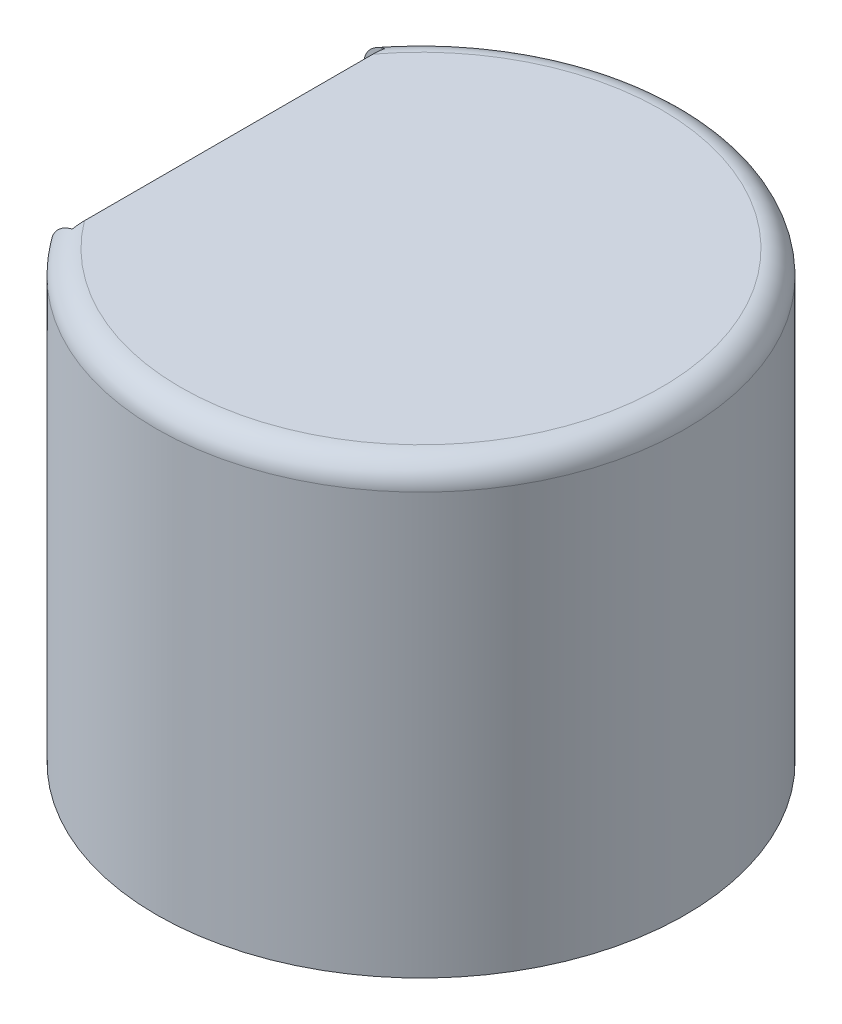
ISO-10303-21;
HEADER;
FILE_DESCRIPTION(('STEP AP214'),'2;1');
FILE_NAME('part.step','',(''),(''),'','','');
FILE_SCHEMA(('AUTOMOTIVE_DESIGN { 1 0 10303 214 1 1 1 1 }'));
ENDSEC;
DATA;
#1=APPLICATION_CONTEXT('core data for automotive mechanical design processes');
#2=APPLICATION_PROTOCOL_DEFINITION('international standard','automotive_design',2000,#1);
#3=PRODUCT_CONTEXT('',#1,'mechanical');
#4=PRODUCT('Part','Part','',(#3));
#5=PRODUCT_RELATED_PRODUCT_CATEGORY('part','',(#4));
#6=PRODUCT_DEFINITION_FORMATION('','',#4);
#7=PRODUCT_DEFINITION_CONTEXT('part definition',#1,'design');
#8=PRODUCT_DEFINITION('design','',#6,#7);
#9=PRODUCT_DEFINITION_SHAPE('','',#8);
#10=(LENGTH_UNIT() NAMED_UNIT(*) SI_UNIT(.MILLI.,.METRE.));
#11=(NAMED_UNIT(*) PLANE_ANGLE_UNIT() SI_UNIT($,.RADIAN.));
#12=(NAMED_UNIT(*) SI_UNIT($,.STERADIAN.) SOLID_ANGLE_UNIT());
#13=UNCERTAINTY_MEASURE_WITH_UNIT(LENGTH_MEASURE(1.E-05),#10,'distance_accuracy_value','');
#14=(GEOMETRIC_REPRESENTATION_CONTEXT(3) GLOBAL_UNCERTAINTY_ASSIGNED_CONTEXT((#13)) GLOBAL_UNIT_ASSIGNED_CONTEXT((#10,
#11,#12)) REPRESENTATION_CONTEXT('',''));
#15=CARTESIAN_POINT('',(0.,0.,0.));
#16=DIRECTION('',(0.,0.,1.));
#17=DIRECTION('',(1.,0.,0.));
#18=AXIS2_PLACEMENT_3D('',#15,#16,#17);
#19=CARTESIAN_POINT('',(0.,-18.5,0.));
#20=DIRECTION('',(0.,1.,0.));
#21=DIRECTION('',(0.,0.,1.));
#22=AXIS2_PLACEMENT_3D('',#19,#20,#21);
#23=CYLINDRICAL_SURFACE('',#22,11.);
#24=CARTESIAN_POINT('',(0.,-18.5,0.));
#25=DIRECTION('',(0.,1.,0.));
#26=DIRECTION('',(0.,0.,1.));
#27=AXIS2_PLACEMENT_3D('',#24,#25,#26);
#28=CIRCLE('',#27,11.);
#29=CARTESIAN_POINT('',(0.,-18.5,11.));
#30=VERTEX_POINT('',#29);
#31=EDGE_CURVE('E114',#30,#30,#28,.T.);
#32=ORIENTED_EDGE('',*,*,#31,.T.);
#33=EDGE_LOOP('',(#32));
#34=FACE_BOUND('',#33,.T.);
#35=DIRECTION('',(0.,1.,0.));
#36=VECTOR('',#35,1.);
#37=CARTESIAN_POINT('',(-8.87411967464942,-4.,-6.5));
#38=LINE('',#37,#36);
#39=CARTESIAN_POINT('',(-8.87411967464942,-4.,-6.5));
#40=VERTEX_POINT('',#39);
#41=CARTESIAN_POINT('',(-8.87411967464942,-1.,-6.5));
#42=VERTEX_POINT('',#41);
#43=EDGE_CURVE('E93',#40,#42,#38,.T.);
#44=ORIENTED_EDGE('',*,*,#43,.T.);
#45=CARTESIAN_POINT('',(0.,-1.,0.));
#46=DIRECTION('',(0.,1.,0.));
#47=DIRECTION('',(0.,0.,1.));
#48=AXIS2_PLACEMENT_3D('',#45,#46,#47);
#49=CIRCLE('',#48,11.);
#50=CARTESIAN_POINT('',(-8.87411967464942,-1.,6.5));
#51=VERTEX_POINT('',#50);
#52=EDGE_CURVE('E47',#42,#51,#49,.F.);
#53=ORIENTED_EDGE('',*,*,#52,.T.);
#54=DIRECTION('',(0.,1.,0.));
#55=VECTOR('',#54,1.);
#56=CARTESIAN_POINT('',(-8.87411967464942,-4.,6.5));
#57=LINE('',#56,#55);
#58=CARTESIAN_POINT('',(-8.87411967464942,-4.,6.5));
#59=VERTEX_POINT('',#58);
#60=EDGE_CURVE('E115',#59,#51,#57,.T.);
#61=ORIENTED_EDGE('',*,*,#60,.F.);
#62=CARTESIAN_POINT('',(0.,-4.,0.));
#63=DIRECTION('',(0.,1.,0.));
#64=DIRECTION('',(0.,0.,1.));
#65=AXIS2_PLACEMENT_3D('',#62,#63,#64);
#66=CIRCLE('',#65,11.);
#67=EDGE_CURVE('E102',#40,#59,#66,.T.);
#68=ORIENTED_EDGE('',*,*,#67,.F.);
#69=EDGE_LOOP('',(#44,#53,#61,#68));
#70=FACE_BOUND('',#69,.T.);
#71=ADVANCED_FACE('F34',(#34,#70),#23,.T.);
#72=CARTESIAN_POINT('',(0.,0.,0.));
#73=DIRECTION('',(0.,1.,0.));
#74=DIRECTION('',(0.,0.,1.));
#75=AXIS2_PLACEMENT_3D('',#72,#73,#74);
#76=PLANE('',#75);
#77=DIRECTION('',(0.,0.,-1.));
#78=VECTOR('',#77,1.);
#79=CARTESIAN_POINT('',(-8.,0.,0.));
#80=LINE('',#79,#78);
#81=CARTESIAN_POINT('',(-8.,0.,6.));
#82=VERTEX_POINT('',#81);
#83=CARTESIAN_POINT('',(-8.,0.,-6.));
#84=VERTEX_POINT('',#83);
#85=EDGE_CURVE('E106',#82,#84,#80,.T.);
#86=ORIENTED_EDGE('',*,*,#85,.F.);
#87=CARTESIAN_POINT('',(0.,0.,0.));
#88=DIRECTION('',(0.,1.,0.));
#89=DIRECTION('',(0.,0.,1.));
#90=AXIS2_PLACEMENT_3D('',#87,#88,#89);
#91=CIRCLE('',#90,10.);
#92=EDGE_CURVE('E120',#82,#84,#91,.T.);
#93=ORIENTED_EDGE('',*,*,#92,.T.);
#94=EDGE_LOOP('',(#86,#93));
#95=FACE_BOUND('',#94,.T.);
#96=ADVANCED_FACE('F143',(#95),#76,.T.);
#97=CARTESIAN_POINT('',(0.,-18.5,0.));
#98=DIRECTION('',(0.,1.,0.));
#99=DIRECTION('',(0.,0.,1.));
#100=AXIS2_PLACEMENT_3D('',#97,#98,#99);
#101=PLANE('',#100);
#102=ORIENTED_EDGE('',*,*,#31,.F.);
#103=EDGE_LOOP('',(#102));
#104=FACE_BOUND('',#103,.T.);
#105=ADVANCED_FACE('F138',(#104),#101,.F.);
#106=CARTESIAN_POINT('',(-8.,-4.,0.));
#107=DIRECTION('',(1.,0.,0.));
#108=DIRECTION('',(0.,0.,-1.));
#109=AXIS2_PLACEMENT_3D('',#106,#107,#108);
#110=PLANE('',#109);
#111=ORIENTED_EDGE('',*,*,#85,.T.);
#112=CARTESIAN_POINT('',(-8.,0.,-6.));
#113=CARTESIAN_POINT('',(-8.,-2.67682782974313E-06,-6.04197839304289));
#114=CARTESIAN_POINT('',(-8.,-0.000951685962686217,-6.08396134287298));
#115=CARTESIAN_POINT('',(-8.,-0.00483422284837745,-6.16772915689217));
#116=CARTESIAN_POINT('',(-8.,-0.00776277312105537,-6.20951425383986));
#117=CARTESIAN_POINT('',(-8.,-0.0156960557339602,-6.29289840157041));
#118=CARTESIAN_POINT('',(-8.,-0.0207011810666996,-6.33449741562996));
#119=CARTESIAN_POINT('',(-8.,-0.0329244346816654,-6.41747458787718));
#120=CARTESIAN_POINT('',(-8.,-0.0401480914454988,-6.45885192858239));
#121=CARTESIAN_POINT('',(-8.,-0.0485372940135661,-6.5));
#122=B_SPLINE_CURVE_WITH_KNOTS('',3,(#112,#113,#114,#115,#116,#117,#118,#119,#120,#121),
.UNSPECIFIED.,.F.,.F.,(4,2,2,2,4),(0.,0.125931068056833,0.251546659545486,0.377186034677817,
0.503141073418634),.UNSPECIFIED.);
#123=CARTESIAN_POINT('',(-8.,-0.0485372940135656,-6.5));
#124=VERTEX_POINT('',#123);
#125=EDGE_CURVE('E92',#84,#124,#122,.T.);
#126=ORIENTED_EDGE('',*,*,#125,.T.);
#127=DIRECTION('',(0.,1.,0.));
#128=VECTOR('',#127,1.);
#129=CARTESIAN_POINT('',(-8.,-4.,-6.5));
#130=LINE('',#129,#128);
#131=CARTESIAN_POINT('',(-8.,-4.,-6.5));
#132=VERTEX_POINT('',#131);
#133=EDGE_CURVE('E85',#132,#124,#130,.T.);
#134=ORIENTED_EDGE('',*,*,#133,.F.);
#135=DIRECTION('',(0.,0.,-1.));
#136=VECTOR('',#135,1.);
#137=CARTESIAN_POINT('',(-8.,-4.,0.));
#138=LINE('',#137,#136);
#139=CARTESIAN_POINT('',(-8.,-4.,6.5));
#140=VERTEX_POINT('',#139);
#141=EDGE_CURVE('E91',#140,#132,#138,.T.);
#142=ORIENTED_EDGE('',*,*,#141,.F.);
#143=DIRECTION('',(0.,1.,0.));
#144=VECTOR('',#143,1.);
#145=CARTESIAN_POINT('',(-8.,-4.,6.5));
#146=LINE('',#145,#144);
#147=CARTESIAN_POINT('',(-8.,-0.0485372940135674,6.5));
#148=VERTEX_POINT('',#147);
#149=EDGE_CURVE('E112',#140,#148,#146,.T.);
#150=ORIENTED_EDGE('',*,*,#149,.T.);
#151=CARTESIAN_POINT('',(-8.,-0.0485372940135672,6.5));
#152=CARTESIAN_POINT('',(-8.,-0.0401480914454997,6.4588519285824));
#153=CARTESIAN_POINT('',(-8.,-0.0329244346816662,6.41747458787718));
#154=CARTESIAN_POINT('',(-8.,-0.0207011810667002,6.33449741562997));
#155=CARTESIAN_POINT('',(-8.,-0.0156960557339608,6.29289840157041));
#156=CARTESIAN_POINT('',(-8.,-0.0077627731210556,6.20951425383987));
#157=CARTESIAN_POINT('',(-8.,-0.00483422284837738,6.16772915689217));
#158=CARTESIAN_POINT('',(-8.,-0.000951685962686061,6.08396134287298));
#159=CARTESIAN_POINT('',(-8.,-2.67682782980998E-06,6.0419783930429));
#160=CARTESIAN_POINT('',(-8.,0.,6.));
#161=B_SPLINE_CURVE_WITH_KNOTS('',3,(#151,#152,#153,#154,#155,#156,#157,#158,#159,#160),
.UNSPECIFIED.,.F.,.F.,(4,2,2,2,4),(0.,0.125955038740817,0.251594413873151,0.377210005361804,
0.503141073418638),.UNSPECIFIED.);
#162=EDGE_CURVE('E123',#148,#82,#161,.T.);
#163=ORIENTED_EDGE('',*,*,#162,.T.);
#164=EDGE_LOOP('',(#111,#126,#134,#142,#150,#163));
#165=FACE_BOUND('',#164,.T.);
#166=ADVANCED_FACE('F88',(#165),#110,.F.);
#167=CARTESIAN_POINT('',(-24.3414213562373,-4.,6.5));
#168=DIRECTION('',(0.,0.,-1.));
#169=DIRECTION('',(-1.,0.,0.));
#170=AXIS2_PLACEMENT_3D('',#167,#168,#169);
#171=PLANE('',#170);
#172=ORIENTED_EDGE('',*,*,#60,.T.);
#173=CARTESIAN_POINT('',(-8.87411967464942,-1.,6.5));
#174=CARTESIAN_POINT('',(-8.8741220013877,-0.975824712904483,6.5));
#175=CARTESIAN_POINT('',(-8.87303211718542,-0.95166261734558,6.5));
#176=CARTESIAN_POINT('',(-8.86870124929425,-0.903542319749535,6.5));
#177=CARTESIAN_POINT('',(-8.86546120106904,-0.879584033630796,6.5));
#178=CARTESIAN_POINT('',(-8.85261793533111,-0.808545929821683,6.5));
#179=CARTESIAN_POINT('',(-8.83989064234933,-0.761997293856896,6.5));
#180=CARTESIAN_POINT('',(-8.80683000042636,-0.671810452413189,6.5));
#181=CARTESIAN_POINT('',(-8.78650652891899,-0.628168553708432,6.5));
#182=CARTESIAN_POINT('',(-8.73923952858996,-0.544598095597684,6.5));
#183=CARTESIAN_POINT('',(-8.71228886983318,-0.504673599805632,6.5));
#184=CARTESIAN_POINT('',(-8.65100078319469,-0.426800599824101,6.5));
#185=CARTESIAN_POINT('',(-8.61630397449595,-0.389136771868048,6.5));
#186=CARTESIAN_POINT('',(-8.54195724016927,-0.319088293543881,6.5));
#187=CARTESIAN_POINT('',(-8.50230495286595,-0.286706177403136,6.5));
#188=CARTESIAN_POINT('',(-8.41162944876616,-0.221932534946043,6.5));
#189=CARTESIAN_POINT('',(-8.35984827026811,-0.190604587115098,6.5));
#190=CARTESIAN_POINT('',(-8.25252663922898,-0.135349625508915,6.5));
#191=CARTESIAN_POINT('',(-8.19698577674571,-0.111423420382045,6.5));
#192=CARTESIAN_POINT('',(-8.09417541173752,-0.0745750437646699,6.5));
#193=CARTESIAN_POINT('',(-8.0473442905294,-0.0604251144055442,6.5));
#194=CARTESIAN_POINT('',(-8.,-0.0485372940135674,6.5));
#195=B_SPLINE_CURVE_WITH_KNOTS('',3,(#173,#174,#175,#176,#177,#178,#179,#180,#181,#182,#183,
#184,#185,#186,#187,#188,#189,#190,#191,#192,#193,#194),.UNSPECIFIED.,.F.,.F.,(4,2,2,2,2,2,2,2,
2,2,4),(0.,0.072475824331258,0.144920137535705,0.288905071397597,0.43270342701617,
0.57665717185559,0.729715465007041,0.882846982651742,1.06375291617771,1.24467860689776,
1.39115924914397),.UNSPECIFIED.);
#196=EDGE_CURVE('E11',#51,#148,#195,.T.);
#197=ORIENTED_EDGE('',*,*,#196,.T.);
#198=ORIENTED_EDGE('',*,*,#149,.F.);
#199=DIRECTION('',(-1.,0.,0.));
#200=VECTOR('',#199,1.);
#201=CARTESIAN_POINT('',(-24.3414213562373,-4.,6.5));
#202=LINE('',#201,#200);
#203=EDGE_CURVE('E94',#140,#59,#202,.T.);
#204=ORIENTED_EDGE('',*,*,#203,.T.);
#205=EDGE_LOOP('',(#172,#197,#198,#204));
#206=FACE_BOUND('',#205,.T.);
#207=ADVANCED_FACE('F137',(#206),#171,.T.);
#208=CARTESIAN_POINT('',(-24.3414213562373,-4.,-6.5));
#209=DIRECTION('',(0.,0.,-1.));
#210=DIRECTION('',(-1.,0.,0.));
#211=AXIS2_PLACEMENT_3D('',#208,#209,#210);
#212=PLANE('',#211);
#213=ORIENTED_EDGE('',*,*,#133,.T.);
#214=CARTESIAN_POINT('',(-8.,-0.048537294013566,-6.5));
#215=CARTESIAN_POINT('',(-8.08202742220604,-0.0690842400047416,-6.5));
#216=CARTESIAN_POINT('',(-8.16281934613723,-0.0966110647232057,-6.5));
#217=CARTESIAN_POINT('',(-8.31850384025139,-0.166335198343342,-6.5));
#218=CARTESIAN_POINT('',(-8.39334457273623,-0.208647064062288,-6.5));
#219=CARTESIAN_POINT('',(-8.50983351624509,-0.292241322263199,-6.5));
#220=CARTESIAN_POINT('',(-8.55439510707568,-0.329442321124894,-6.5));
#221=CARTESIAN_POINT('',(-8.63683261976486,-0.410509052515207,-6.5));
#222=CARTESIAN_POINT('',(-8.67472614960621,-0.454356645239449,-6.5));
#223=CARTESIAN_POINT('',(-8.74242773469292,-0.548646506167052,-6.5));
#224=CARTESIAN_POINT('',(-8.77214963057604,-0.599151314065799,-6.5));
#225=CARTESIAN_POINT('',(-8.82099052608364,-0.705060130841552,-6.5));
#226=CARTESIAN_POINT('',(-8.84012728588363,-0.76045575145956,-6.5));
#227=CARTESIAN_POINT('',(-8.86013474217407,-0.84713795921251,-6.5));
#228=CARTESIAN_POINT('',(-8.86536361641527,-0.877468289405604,-6.5));
#229=CARTESIAN_POINT('',(-8.87235981817603,-0.938523856755825,-6.5));
#230=CARTESIAN_POINT('',(-8.87412723636628,-0.96924908354766,-6.5));
#231=CARTESIAN_POINT('',(-8.87411967464942,-1.,-6.5));
#232=B_SPLINE_CURVE_WITH_KNOTS('',3,(#214,#215,#216,#217,#218,#219,#220,#221,#222,#223,#224,
#225,#226,#227,#228,#229,#230,#231),.UNSPECIFIED.,.F.,.F.,(4,2,2,2,2,2,2,2,4),(0.,
0.254215920690131,0.510446896704895,0.683919565013013,0.856927045400183,1.03169422283117,
1.20616727229338,1.29832333315292,1.39047698000969),.UNSPECIFIED.);
#233=EDGE_CURVE('E61',#124,#42,#232,.T.);
#234=ORIENTED_EDGE('',*,*,#233,.T.);
#235=ORIENTED_EDGE('',*,*,#43,.F.);
#236=DIRECTION('',(-1.,0.,0.));
#237=VECTOR('',#236,1.);
#238=CARTESIAN_POINT('',(-24.3414213562373,-4.,-6.5));
#239=LINE('',#238,#237);
#240=EDGE_CURVE('E97',#132,#40,#239,.T.);
#241=ORIENTED_EDGE('',*,*,#240,.F.);
#242=EDGE_LOOP('',(#213,#234,#235,#241));
#243=FACE_BOUND('',#242,.T.);
#244=ADVANCED_FACE('F98',(#243),#212,.F.);
#245=CARTESIAN_POINT('',(-24.3414213562373,-4.,0.));
#246=DIRECTION('',(0.,1.,0.));
#247=DIRECTION('',(0.,0.,1.));
#248=AXIS2_PLACEMENT_3D('',#245,#246,#247);
#249=PLANE('',#248);
#250=ORIENTED_EDGE('',*,*,#141,.T.);
#251=ORIENTED_EDGE('',*,*,#240,.T.);
#252=ORIENTED_EDGE('',*,*,#67,.T.);
#253=ORIENTED_EDGE('',*,*,#203,.F.);
#254=EDGE_LOOP('',(#250,#251,#252,#253));
#255=FACE_BOUND('',#254,.T.);
#256=ADVANCED_FACE('F105',(#255),#249,.T.);
#257=CARTESIAN_POINT('',(0.,-1.,0.));
#258=DIRECTION('',(0.,1.,0.));
#259=DIRECTION('',(0.,0.,1.));
#260=AXIS2_PLACEMENT_3D('',#257,#258,#259);
#261=TOROIDAL_SURFACE('',#260,10.,1.);
#262=ORIENTED_EDGE('',*,*,#196,.F.);
#263=ORIENTED_EDGE('',*,*,#52,.F.);
#264=ORIENTED_EDGE('',*,*,#233,.F.);
#265=ORIENTED_EDGE('',*,*,#125,.F.);
#266=ORIENTED_EDGE('',*,*,#92,.F.);
#267=ORIENTED_EDGE('',*,*,#162,.F.);
#268=EDGE_LOOP('',(#262,#263,#264,#265,#266,#267));
#269=FACE_BOUND('',#268,.T.);
#270=ADVANCED_FACE('F36',(#269),#261,.T.);
#271=CLOSED_SHELL('',(#71,#96,#105,#166,#207,#244,#256,#270));
#272=MANIFOLD_SOLID_BREP('B2',#271);
#273=ADVANCED_BREP_SHAPE_REPRESENTATION('',(#18,#272),#14);
#274=SHAPE_DEFINITION_REPRESENTATION(#9,#273);
ENDSEC;
END-ISO-10303-21;
